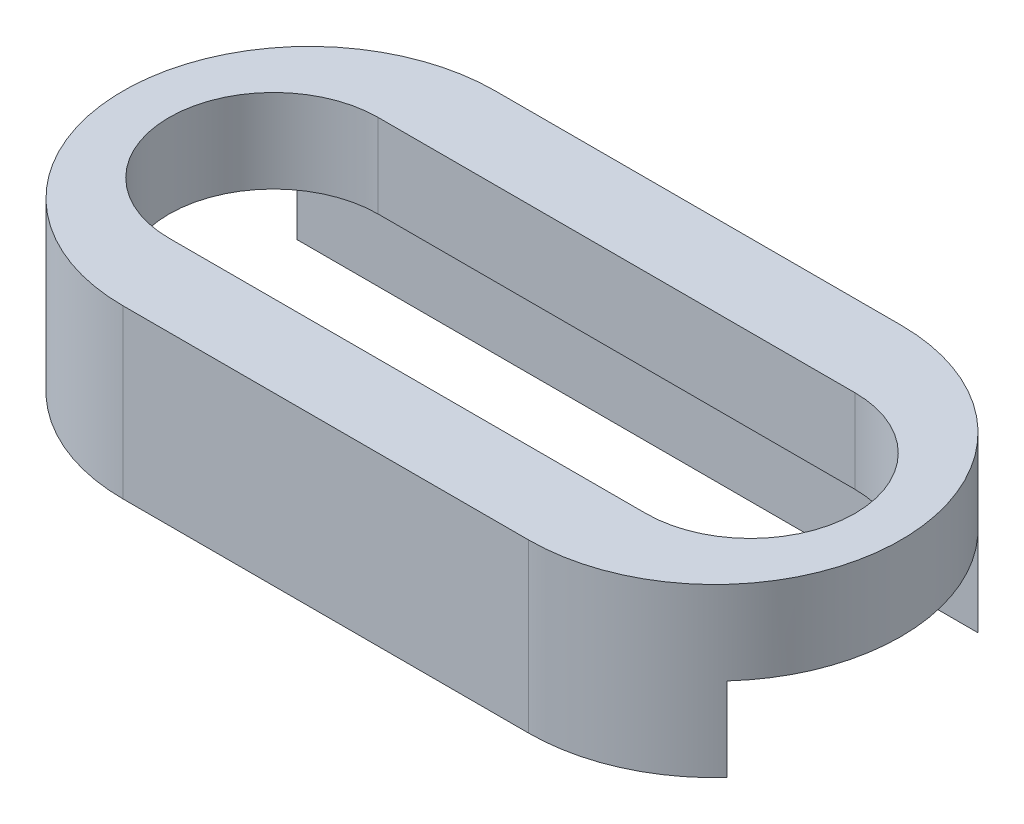
ISO-10303-21;
HEADER;
FILE_DESCRIPTION(('STEP AP214'),'2;1');
FILE_NAME('part.step','',(''),(''),'','','');
FILE_SCHEMA(('AUTOMOTIVE_DESIGN { 1 0 10303 214 1 1 1 1 }'));
ENDSEC;
DATA;
#1=APPLICATION_CONTEXT('core data for automotive mechanical design processes');
#2=APPLICATION_PROTOCOL_DEFINITION('international standard','automotive_design',2000,#1);
#3=PRODUCT_CONTEXT('',#1,'mechanical');
#4=PRODUCT('Part','Part','',(#3));
#5=PRODUCT_RELATED_PRODUCT_CATEGORY('part','',(#4));
#6=PRODUCT_DEFINITION_FORMATION('','',#4);
#7=PRODUCT_DEFINITION_CONTEXT('part definition',#1,'design');
#8=PRODUCT_DEFINITION('design','',#6,#7);
#9=PRODUCT_DEFINITION_SHAPE('','',#8);
#10=(LENGTH_UNIT() NAMED_UNIT(*) SI_UNIT(.MILLI.,.METRE.));
#11=(NAMED_UNIT(*) PLANE_ANGLE_UNIT() SI_UNIT($,.RADIAN.));
#12=(NAMED_UNIT(*) SI_UNIT($,.STERADIAN.) SOLID_ANGLE_UNIT());
#13=UNCERTAINTY_MEASURE_WITH_UNIT(LENGTH_MEASURE(1.E-05),#10,'distance_accuracy_value','');
#14=(GEOMETRIC_REPRESENTATION_CONTEXT(3) GLOBAL_UNCERTAINTY_ASSIGNED_CONTEXT((#13)) GLOBAL_UNIT_ASSIGNED_CONTEXT((#10,
#11,#12)) REPRESENTATION_CONTEXT('',''));
#15=CARTESIAN_POINT('',(0.,0.,0.));
#16=DIRECTION('',(0.,0.,1.));
#17=DIRECTION('',(1.,0.,0.));
#18=AXIS2_PLACEMENT_3D('',#15,#16,#17);
#19=CARTESIAN_POINT('',(-4.65,1.,1.5));
#20=DIRECTION('',(0.,1.,0.));
#21=DIRECTION('',(1.,0.,0.));
#22=AXIS2_PLACEMENT_3D('',#19,#20,#21);
#23=PLANE('',#22);
#24=DIRECTION('',(-1.,0.,0.));
#25=VECTOR('',#24,1.);
#26=CARTESIAN_POINT('',(-2.85,1.,-1.25));
#27=LINE('',#26,#25);
#28=CARTESIAN_POINT('',(2.85,1.,-1.25));
#29=VERTEX_POINT('',#28);
#30=CARTESIAN_POINT('',(-2.85,1.,-1.25));
#31=VERTEX_POINT('',#30);
#32=EDGE_CURVE('E240',#29,#31,#27,.T.);
#33=ORIENTED_EDGE('',*,*,#32,.T.);
#34=CARTESIAN_POINT('',(-2.85,1.,0.));
#35=DIRECTION('',(0.,-1.,0.));
#36=DIRECTION('',(0.,0.,1.));
#37=AXIS2_PLACEMENT_3D('',#34,#35,#36);
#38=CIRCLE('',#37,1.25);
#39=CARTESIAN_POINT('',(-2.85,1.,1.25));
#40=VERTEX_POINT('',#39);
#41=EDGE_CURVE('E42',#40,#31,#38,.T.);
#42=ORIENTED_EDGE('',*,*,#41,.F.);
#43=DIRECTION('',(-1.,0.,0.));
#44=VECTOR('',#43,1.);
#45=CARTESIAN_POINT('',(-2.85,1.,1.25));
#46=LINE('',#45,#44);
#47=CARTESIAN_POINT('',(2.85,1.,1.25));
#48=VERTEX_POINT('',#47);
#49=EDGE_CURVE('E214',#48,#40,#46,.T.);
#50=ORIENTED_EDGE('',*,*,#49,.F.);
#51=CARTESIAN_POINT('',(2.85,1.,0.));
#52=DIRECTION('',(0.,-1.,0.));
#53=DIRECTION('',(0.,0.,1.));
#54=AXIS2_PLACEMENT_3D('',#51,#52,#53);
#55=CIRCLE('',#54,1.25);
#56=EDGE_CURVE('E215',#29,#48,#55,.T.);
#57=ORIENTED_EDGE('',*,*,#56,.F.);
#58=EDGE_LOOP('',(#33,#42,#50,#57));
#59=FACE_BOUND('',#58,.T.);
#60=DIRECTION('',(1.,0.,0.));
#61=VECTOR('',#60,1.);
#62=CARTESIAN_POINT('',(-4.65,1.,-1.5));
#63=LINE('',#62,#61);
#64=CARTESIAN_POINT('',(-4.06835784295448,1.,-1.5));
#65=VERTEX_POINT('',#64);
#66=CARTESIAN_POINT('',(4.06835784295448,1.,-1.5));
#67=VERTEX_POINT('',#66);
#68=EDGE_CURVE('E11',#65,#67,#63,.T.);
#69=ORIENTED_EDGE('',*,*,#68,.T.);
#70=CARTESIAN_POINT('',(2.425,1.,0.));
#71=DIRECTION('',(0.,1.,0.));
#72=DIRECTION('',(0.,0.,1.));
#73=AXIS2_PLACEMENT_3D('',#70,#71,#72);
#74=CIRCLE('',#73,2.225);
#75=CARTESIAN_POINT('',(4.06835784295448,1.,1.5));
#76=VERTEX_POINT('',#75);
#77=EDGE_CURVE('E191',#76,#67,#74,.T.);
#78=ORIENTED_EDGE('',*,*,#77,.F.);
#79=DIRECTION('',(1.,0.,0.));
#80=VECTOR('',#79,1.);
#81=CARTESIAN_POINT('',(-4.65,1.,1.5));
#82=LINE('',#81,#80);
#83=CARTESIAN_POINT('',(-4.06835784295448,1.,1.5));
#84=VERTEX_POINT('',#83);
#85=EDGE_CURVE('E27',#84,#76,#82,.T.);
#86=ORIENTED_EDGE('',*,*,#85,.F.);
#87=CARTESIAN_POINT('',(-2.425,1.,0.));
#88=DIRECTION('',(0.,1.,0.));
#89=DIRECTION('',(0.,0.,1.));
#90=AXIS2_PLACEMENT_3D('',#87,#88,#89);
#91=CIRCLE('',#90,2.225);
#92=EDGE_CURVE('E245',#65,#84,#91,.T.);
#93=ORIENTED_EDGE('',*,*,#92,.F.);
#94=EDGE_LOOP('',(#69,#78,#86,#93));
#95=FACE_BOUND('',#94,.T.);
#96=ADVANCED_FACE('F17',(#59,#95),#23,.F.);
#97=CARTESIAN_POINT('',(-4.65,0.,-1.5));
#98=DIRECTION('',(0.,0.,-1.));
#99=DIRECTION('',(0.,-1.,0.));
#100=AXIS2_PLACEMENT_3D('',#97,#98,#99);
#101=PLANE('',#100);
#102=DIRECTION('',(1.,0.,0.));
#103=VECTOR('',#102,1.);
#104=CARTESIAN_POINT('',(-4.65,0.,-1.5));
#105=LINE('',#104,#103);
#106=CARTESIAN_POINT('',(-4.06835784295448,0.,-1.5));
#107=VERTEX_POINT('',#106);
#108=CARTESIAN_POINT('',(4.06835784295448,0.,-1.5));
#109=VERTEX_POINT('',#108);
#110=EDGE_CURVE('E171',#107,#109,#105,.T.);
#111=ORIENTED_EDGE('',*,*,#110,.T.);
#112=DIRECTION('',(0.,-1.,0.));
#113=VECTOR('',#112,1.);
#114=CARTESIAN_POINT('',(4.06835784295448,2.,-1.5));
#115=LINE('',#114,#113);
#116=EDGE_CURVE('E188',#67,#109,#115,.T.);
#117=ORIENTED_EDGE('',*,*,#116,.F.);
#118=ORIENTED_EDGE('',*,*,#68,.F.);
#119=DIRECTION('',(0.,1.,0.));
#120=VECTOR('',#119,1.);
#121=CARTESIAN_POINT('',(-4.06835784295448,2.,-1.5));
#122=LINE('',#121,#120);
#123=EDGE_CURVE('E146',#107,#65,#122,.T.);
#124=ORIENTED_EDGE('',*,*,#123,.F.);
#125=EDGE_LOOP('',(#111,#117,#118,#124));
#126=FACE_BOUND('',#125,.T.);
#127=ADVANCED_FACE('F287',(#126),#101,.F.);
#128=CARTESIAN_POINT('',(-4.65,0.,1.5));
#129=DIRECTION('',(0.,0.,1.));
#130=DIRECTION('',(1.,0.,0.));
#131=AXIS2_PLACEMENT_3D('',#128,#129,#130);
#132=PLANE('',#131);
#133=ORIENTED_EDGE('',*,*,#85,.T.);
#134=DIRECTION('',(0.,1.,0.));
#135=VECTOR('',#134,1.);
#136=CARTESIAN_POINT('',(4.06835784295448,2.,1.5));
#137=LINE('',#136,#135);
#138=CARTESIAN_POINT('',(4.06835784295448,0.,1.5));
#139=VERTEX_POINT('',#138);
#140=EDGE_CURVE('E197',#139,#76,#137,.T.);
#141=ORIENTED_EDGE('',*,*,#140,.F.);
#142=DIRECTION('',(1.,0.,0.));
#143=VECTOR('',#142,1.);
#144=CARTESIAN_POINT('',(-4.65,0.,1.5));
#145=LINE('',#144,#143);
#146=CARTESIAN_POINT('',(-4.06835784295448,0.,1.5));
#147=VERTEX_POINT('',#146);
#148=EDGE_CURVE('E209',#147,#139,#145,.T.);
#149=ORIENTED_EDGE('',*,*,#148,.F.);
#150=DIRECTION('',(0.,-1.,0.));
#151=VECTOR('',#150,1.);
#152=CARTESIAN_POINT('',(-4.06835784295448,2.,1.5));
#153=LINE('',#152,#151);
#154=EDGE_CURVE('E249',#84,#147,#153,.T.);
#155=ORIENTED_EDGE('',*,*,#154,.F.);
#156=EDGE_LOOP('',(#133,#141,#149,#155));
#157=FACE_BOUND('',#156,.T.);
#158=ADVANCED_FACE('F289',(#157),#132,.F.);
#159=CARTESIAN_POINT('',(-2.85,0.,0.));
#160=DIRECTION('',(0.,1.,0.));
#161=DIRECTION('',(0.,0.,1.));
#162=AXIS2_PLACEMENT_3D('',#159,#160,#161);
#163=CYLINDRICAL_SURFACE('',#162,1.25);
#164=DIRECTION('',(0.,1.,0.));
#165=VECTOR('',#164,1.);
#166=CARTESIAN_POINT('',(-2.85,0.,1.25));
#167=LINE('',#166,#165);
#168=CARTESIAN_POINT('',(-2.85,2.,1.25));
#169=VERTEX_POINT('',#168);
#170=EDGE_CURVE('E225',#40,#169,#167,.T.);
#171=ORIENTED_EDGE('',*,*,#170,.F.);
#172=ORIENTED_EDGE('',*,*,#41,.T.);
#173=DIRECTION('',(0.,1.,0.));
#174=VECTOR('',#173,1.);
#175=CARTESIAN_POINT('',(-2.85,0.,-1.25));
#176=LINE('',#175,#174);
#177=CARTESIAN_POINT('',(-2.85,2.,-1.25));
#178=VERTEX_POINT('',#177);
#179=EDGE_CURVE('E227',#31,#178,#176,.T.);
#180=ORIENTED_EDGE('',*,*,#179,.T.);
#181=CARTESIAN_POINT('',(-2.85,2.,0.));
#182=DIRECTION('',(0.,1.,0.));
#183=DIRECTION('',(0.,0.,1.));
#184=AXIS2_PLACEMENT_3D('',#181,#182,#183);
#185=CIRCLE('',#184,1.25);
#186=EDGE_CURVE('E20',#178,#169,#185,.T.);
#187=ORIENTED_EDGE('',*,*,#186,.T.);
#188=EDGE_LOOP('',(#171,#172,#180,#187));
#189=FACE_BOUND('',#188,.T.);
#190=ADVANCED_FACE('F296',(#189),#163,.F.);
#191=CARTESIAN_POINT('',(-2.85,0.,1.25));
#192=DIRECTION('',(0.,0.,1.));
#193=DIRECTION('',(1.,0.,0.));
#194=AXIS2_PLACEMENT_3D('',#191,#192,#193);
#195=PLANE('',#194);
#196=DIRECTION('',(0.,1.,0.));
#197=VECTOR('',#196,1.);
#198=CARTESIAN_POINT('',(2.85,0.,1.25));
#199=LINE('',#198,#197);
#200=CARTESIAN_POINT('',(2.85,2.,1.25));
#201=VERTEX_POINT('',#200);
#202=EDGE_CURVE('E212',#48,#201,#199,.T.);
#203=ORIENTED_EDGE('',*,*,#202,.F.);
#204=ORIENTED_EDGE('',*,*,#49,.T.);
#205=ORIENTED_EDGE('',*,*,#170,.T.);
#206=DIRECTION('',(1.,0.,0.));
#207=VECTOR('',#206,1.);
#208=CARTESIAN_POINT('',(-2.85,2.,1.25));
#209=LINE('',#208,#207);
#210=EDGE_CURVE('E192',#169,#201,#209,.T.);
#211=ORIENTED_EDGE('',*,*,#210,.T.);
#212=EDGE_LOOP('',(#203,#204,#205,#211));
#213=FACE_BOUND('',#212,.T.);
#214=ADVANCED_FACE('F301',(#213),#195,.F.);
#215=CARTESIAN_POINT('',(2.85,0.,0.));
#216=DIRECTION('',(0.,1.,0.));
#217=DIRECTION('',(0.,0.,1.));
#218=AXIS2_PLACEMENT_3D('',#215,#216,#217);
#219=CYLINDRICAL_SURFACE('',#218,1.25);
#220=DIRECTION('',(0.,1.,0.));
#221=VECTOR('',#220,1.);
#222=CARTESIAN_POINT('',(2.85,0.,-1.25));
#223=LINE('',#222,#221);
#224=CARTESIAN_POINT('',(2.85,2.,-1.25));
#225=VERTEX_POINT('',#224);
#226=EDGE_CURVE('E235',#29,#225,#223,.T.);
#227=ORIENTED_EDGE('',*,*,#226,.F.);
#228=ORIENTED_EDGE('',*,*,#56,.T.);
#229=ORIENTED_EDGE('',*,*,#202,.T.);
#230=CARTESIAN_POINT('',(2.85,2.,0.));
#231=DIRECTION('',(0.,1.,0.));
#232=DIRECTION('',(0.,0.,1.));
#233=AXIS2_PLACEMENT_3D('',#230,#231,#232);
#234=CIRCLE('',#233,1.25);
#235=EDGE_CURVE('E196',#201,#225,#234,.T.);
#236=ORIENTED_EDGE('',*,*,#235,.T.);
#237=EDGE_LOOP('',(#227,#228,#229,#236));
#238=FACE_BOUND('',#237,.T.);
#239=ADVANCED_FACE('F303',(#238),#219,.F.);
#240=CARTESIAN_POINT('',(-2.85,0.,-1.25));
#241=DIRECTION('',(0.,0.,1.));
#242=DIRECTION('',(1.,0.,0.));
#243=AXIS2_PLACEMENT_3D('',#240,#241,#242);
#244=PLANE('',#243);
#245=ORIENTED_EDGE('',*,*,#32,.F.);
#246=ORIENTED_EDGE('',*,*,#226,.T.);
#247=DIRECTION('',(1.,0.,0.));
#248=VECTOR('',#247,1.);
#249=CARTESIAN_POINT('',(-2.85,2.,-1.25));
#250=LINE('',#249,#248);
#251=EDGE_CURVE('E272',#178,#225,#250,.T.);
#252=ORIENTED_EDGE('',*,*,#251,.F.);
#253=ORIENTED_EDGE('',*,*,#179,.F.);
#254=EDGE_LOOP('',(#245,#246,#252,#253));
#255=FACE_BOUND('',#254,.T.);
#256=ADVANCED_FACE('F306',(#255),#244,.T.);
#257=CARTESIAN_POINT('',(-2.425,2.,-2.225));
#258=DIRECTION('',(0.,0.,1.));
#259=DIRECTION('',(1.,0.,0.));
#260=AXIS2_PLACEMENT_3D('',#257,#258,#259);
#261=PLANE('',#260);
#262=DIRECTION('',(-1.,0.,0.));
#263=VECTOR('',#262,1.);
#264=CARTESIAN_POINT('',(-2.425,0.,-2.225));
#265=LINE('',#264,#263);
#266=CARTESIAN_POINT('',(2.425,0.,-2.225));
#267=VERTEX_POINT('',#266);
#268=CARTESIAN_POINT('',(-2.425,0.,-2.225));
#269=VERTEX_POINT('',#268);
#270=EDGE_CURVE('E162',#267,#269,#265,.T.);
#271=ORIENTED_EDGE('',*,*,#270,.T.);
#272=DIRECTION('',(0.,-1.,0.));
#273=VECTOR('',#272,1.);
#274=CARTESIAN_POINT('',(-2.425,2.,-2.225));
#275=LINE('',#274,#273);
#276=CARTESIAN_POINT('',(-2.425,2.,-2.225));
#277=VERTEX_POINT('',#276);
#278=EDGE_CURVE('E116',#277,#269,#275,.T.);
#279=ORIENTED_EDGE('',*,*,#278,.F.);
#280=DIRECTION('',(-1.,0.,0.));
#281=VECTOR('',#280,1.);
#282=CARTESIAN_POINT('',(-2.425,2.,-2.225));
#283=LINE('',#282,#281);
#284=CARTESIAN_POINT('',(2.425,2.,-2.225));
#285=VERTEX_POINT('',#284);
#286=EDGE_CURVE('E205',#285,#277,#283,.T.);
#287=ORIENTED_EDGE('',*,*,#286,.F.);
#288=DIRECTION('',(0.,-1.,0.));
#289=VECTOR('',#288,1.);
#290=CARTESIAN_POINT('',(2.425,2.,-2.225));
#291=LINE('',#290,#289);
#292=EDGE_CURVE('E164',#285,#267,#291,.T.);
#293=ORIENTED_EDGE('',*,*,#292,.T.);
#294=EDGE_LOOP('',(#271,#279,#287,#293));
#295=FACE_BOUND('',#294,.T.);
#296=ADVANCED_FACE('F163',(#295),#261,.F.);
#297=CARTESIAN_POINT('',(2.425,2.,0.));
#298=DIRECTION('',(0.,-1.,0.));
#299=DIRECTION('',(0.,0.,-1.));
#300=AXIS2_PLACEMENT_3D('',#297,#298,#299);
#301=CYLINDRICAL_SURFACE('',#300,2.225);
#302=CARTESIAN_POINT('',(2.425,0.,0.));
#303=DIRECTION('',(0.,1.,0.));
#304=DIRECTION('',(0.,0.,1.));
#305=AXIS2_PLACEMENT_3D('',#302,#303,#304);
#306=CIRCLE('',#305,2.225);
#307=CARTESIAN_POINT('',(2.425,0.,2.225));
#308=VERTEX_POINT('',#307);
#309=EDGE_CURVE('E187',#308,#139,#306,.T.);
#310=ORIENTED_EDGE('',*,*,#309,.T.);
#311=ORIENTED_EDGE('',*,*,#140,.T.);
#312=ORIENTED_EDGE('',*,*,#77,.T.);
#313=ORIENTED_EDGE('',*,*,#116,.T.);
#314=CARTESIAN_POINT('',(2.425,0.,0.));
#315=DIRECTION('',(0.,1.,0.));
#316=DIRECTION('',(0.,0.,1.));
#317=AXIS2_PLACEMENT_3D('',#314,#315,#316);
#318=CIRCLE('',#317,2.225);
#319=EDGE_CURVE('E179',#109,#267,#318,.T.);
#320=ORIENTED_EDGE('',*,*,#319,.T.);
#321=ORIENTED_EDGE('',*,*,#292,.F.);
#322=CARTESIAN_POINT('',(2.425,2.,0.));
#323=DIRECTION('',(0.,1.,0.));
#324=DIRECTION('',(0.,0.,1.));
#325=AXIS2_PLACEMENT_3D('',#322,#323,#324);
#326=CIRCLE('',#325,2.225);
#327=CARTESIAN_POINT('',(2.425,2.,2.225));
#328=VERTEX_POINT('',#327);
#329=EDGE_CURVE('E201',#328,#285,#326,.T.);
#330=ORIENTED_EDGE('',*,*,#329,.F.);
#331=DIRECTION('',(0.,-1.,0.));
#332=VECTOR('',#331,1.);
#333=CARTESIAN_POINT('',(2.425,2.,2.225));
#334=LINE('',#333,#332);
#335=EDGE_CURVE('E129',#328,#308,#334,.T.);
#336=ORIENTED_EDGE('',*,*,#335,.T.);
#337=EDGE_LOOP('',(#310,#311,#312,#313,#320,#321,#330,#336));
#338=FACE_BOUND('',#337,.T.);
#339=ADVANCED_FACE('F284',(#338),#301,.T.);
#340=CARTESIAN_POINT('',(-2.425,2.,2.225));
#341=DIRECTION('',(0.,0.,-1.));
#342=DIRECTION('',(0.,-1.,0.));
#343=AXIS2_PLACEMENT_3D('',#340,#341,#342);
#344=PLANE('',#343);
#345=DIRECTION('',(1.,0.,0.));
#346=VECTOR('',#345,1.);
#347=CARTESIAN_POINT('',(-2.425,0.,2.225));
#348=LINE('',#347,#346);
#349=CARTESIAN_POINT('',(-2.425,0.,2.225));
#350=VERTEX_POINT('',#349);
#351=EDGE_CURVE('E185',#350,#308,#348,.T.);
#352=ORIENTED_EDGE('',*,*,#351,.T.);
#353=ORIENTED_EDGE('',*,*,#335,.F.);
#354=DIRECTION('',(1.,0.,0.));
#355=VECTOR('',#354,1.);
#356=CARTESIAN_POINT('',(-2.425,2.,2.225));
#357=LINE('',#356,#355);
#358=CARTESIAN_POINT('',(-2.425,2.,2.225));
#359=VERTEX_POINT('',#358);
#360=EDGE_CURVE('E206',#359,#328,#357,.T.);
#361=ORIENTED_EDGE('',*,*,#360,.F.);
#362=DIRECTION('',(0.,-1.,0.));
#363=VECTOR('',#362,1.);
#364=CARTESIAN_POINT('',(-2.425,2.,2.225));
#365=LINE('',#364,#363);
#366=EDGE_CURVE('E159',#359,#350,#365,.T.);
#367=ORIENTED_EDGE('',*,*,#366,.T.);
#368=EDGE_LOOP('',(#352,#353,#361,#367));
#369=FACE_BOUND('',#368,.T.);
#370=ADVANCED_FACE('F315',(#369),#344,.F.);
#371=CARTESIAN_POINT('',(-2.425,2.,0.));
#372=DIRECTION('',(0.,-1.,0.));
#373=DIRECTION('',(0.,0.,-1.));
#374=AXIS2_PLACEMENT_3D('',#371,#372,#373);
#375=CYLINDRICAL_SURFACE('',#374,2.225);
#376=ORIENTED_EDGE('',*,*,#123,.T.);
#377=ORIENTED_EDGE('',*,*,#92,.T.);
#378=ORIENTED_EDGE('',*,*,#154,.T.);
#379=CARTESIAN_POINT('',(-2.425,0.,0.));
#380=DIRECTION('',(0.,1.,0.));
#381=DIRECTION('',(0.,0.,1.));
#382=AXIS2_PLACEMENT_3D('',#379,#380,#381);
#383=CIRCLE('',#382,2.225);
#384=EDGE_CURVE('E183',#147,#350,#383,.T.);
#385=ORIENTED_EDGE('',*,*,#384,.T.);
#386=ORIENTED_EDGE('',*,*,#366,.F.);
#387=CARTESIAN_POINT('',(-2.425,2.,0.));
#388=DIRECTION('',(0.,1.,0.));
#389=DIRECTION('',(0.,0.,1.));
#390=AXIS2_PLACEMENT_3D('',#387,#388,#389);
#391=CIRCLE('',#390,2.225);
#392=EDGE_CURVE('E157',#277,#359,#391,.T.);
#393=ORIENTED_EDGE('',*,*,#392,.F.);
#394=ORIENTED_EDGE('',*,*,#278,.T.);
#395=CARTESIAN_POINT('',(-2.425,0.,0.));
#396=DIRECTION('',(0.,1.,0.));
#397=DIRECTION('',(0.,0.,1.));
#398=AXIS2_PLACEMENT_3D('',#395,#396,#397);
#399=CIRCLE('',#398,2.225);
#400=EDGE_CURVE('E154',#269,#107,#399,.T.);
#401=ORIENTED_EDGE('',*,*,#400,.T.);
#402=EDGE_LOOP('',(#376,#377,#378,#385,#386,#393,#394,#401));
#403=FACE_BOUND('',#402,.T.);
#404=ADVANCED_FACE('F152',(#403),#375,.T.);
#405=CARTESIAN_POINT('',(-2.425,0.,0.));
#406=DIRECTION('',(0.,1.,0.));
#407=DIRECTION('',(1.,0.,0.));
#408=AXIS2_PLACEMENT_3D('',#405,#406,#407);
#409=PLANE('',#408);
#410=ORIENTED_EDGE('',*,*,#319,.F.);
#411=ORIENTED_EDGE('',*,*,#110,.F.);
#412=ORIENTED_EDGE('',*,*,#400,.F.);
#413=ORIENTED_EDGE('',*,*,#270,.F.);
#414=EDGE_LOOP('',(#410,#411,#412,#413));
#415=FACE_BOUND('',#414,.T.);
#416=ADVANCED_FACE('F170',(#415),#409,.F.);
#417=CARTESIAN_POINT('',(-2.425,2.,0.));
#418=DIRECTION('',(0.,1.,0.));
#419=DIRECTION('',(1.,0.,0.));
#420=AXIS2_PLACEMENT_3D('',#417,#418,#419);
#421=PLANE('',#420);
#422=ORIENTED_EDGE('',*,*,#186,.F.);
#423=ORIENTED_EDGE('',*,*,#251,.T.);
#424=ORIENTED_EDGE('',*,*,#235,.F.);
#425=ORIENTED_EDGE('',*,*,#210,.F.);
#426=EDGE_LOOP('',(#422,#423,#424,#425));
#427=FACE_BOUND('',#426,.T.);
#428=ORIENTED_EDGE('',*,*,#392,.T.);
#429=ORIENTED_EDGE('',*,*,#360,.T.);
#430=ORIENTED_EDGE('',*,*,#329,.T.);
#431=ORIENTED_EDGE('',*,*,#286,.T.);
#432=EDGE_LOOP('',(#428,#429,#430,#431));
#433=FACE_BOUND('',#432,.T.);
#434=ADVANCED_FACE('F282',(#427,#433),#421,.T.);
#435=CARTESIAN_POINT('',(-2.425,0.,0.));
#436=DIRECTION('',(0.,1.,0.));
#437=DIRECTION('',(1.,0.,0.));
#438=AXIS2_PLACEMENT_3D('',#435,#436,#437);
#439=PLANE('',#438);
#440=ORIENTED_EDGE('',*,*,#384,.F.);
#441=ORIENTED_EDGE('',*,*,#148,.T.);
#442=ORIENTED_EDGE('',*,*,#309,.F.);
#443=ORIENTED_EDGE('',*,*,#351,.F.);
#444=EDGE_LOOP('',(#440,#441,#442,#443));
#445=FACE_BOUND('',#444,.T.);
#446=ADVANCED_FACE('F316',(#445),#439,.F.);
#447=CLOSED_SHELL('',(#96,#127,#158,#190,#214,#239,#256,#296,#339,#370,#404,#416,#434,#446));
#448=MANIFOLD_SOLID_BREP('B1',#447);
#449=ADVANCED_BREP_SHAPE_REPRESENTATION('',(#18,#448),#14);
#450=SHAPE_DEFINITION_REPRESENTATION(#9,#449);
ENDSEC;
END-ISO-10303-21;
